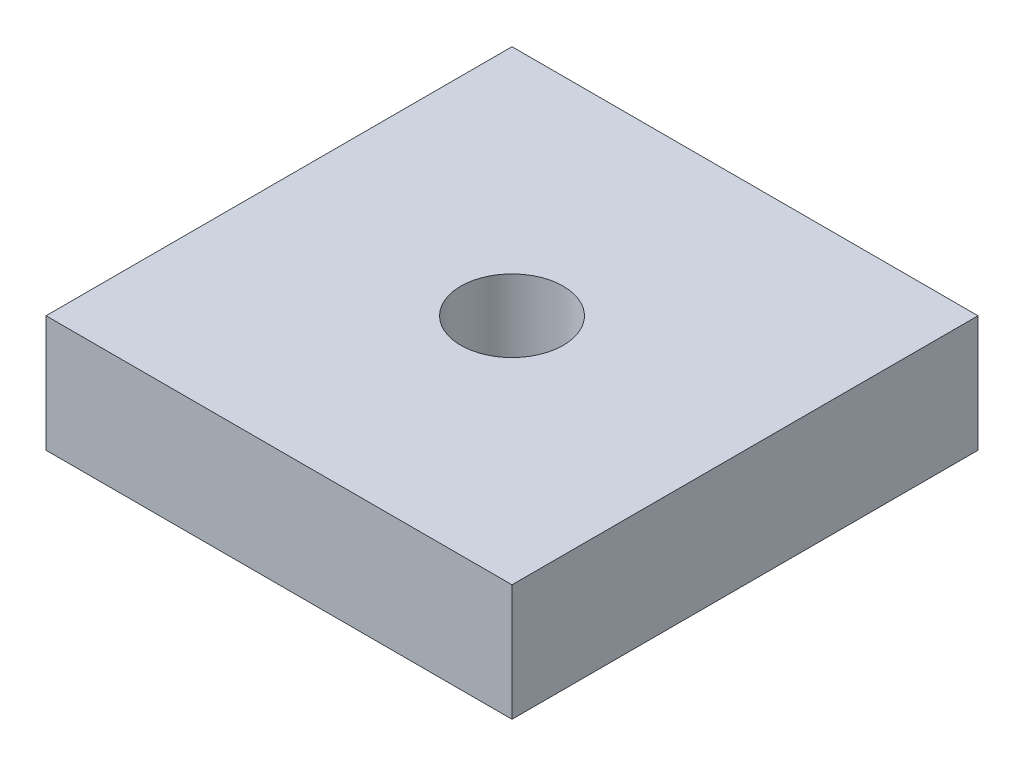
ISO-10303-21;
HEADER;
FILE_DESCRIPTION(('STEP AP214'),'2;1');
FILE_NAME('part.step','',(''),(''),'','','');
FILE_SCHEMA(('AUTOMOTIVE_DESIGN { 1 0 10303 214 1 1 1 1 }'));
ENDSEC;
DATA;
#1=APPLICATION_CONTEXT('core data for automotive mechanical design processes');
#2=APPLICATION_PROTOCOL_DEFINITION('international standard','automotive_design',2000,#1);
#3=PRODUCT_CONTEXT('',#1,'mechanical');
#4=PRODUCT('Part','Part','',(#3));
#5=PRODUCT_RELATED_PRODUCT_CATEGORY('part','',(#4));
#6=PRODUCT_DEFINITION_FORMATION('','',#4);
#7=PRODUCT_DEFINITION_CONTEXT('part definition',#1,'design');
#8=PRODUCT_DEFINITION('design','',#6,#7);
#9=PRODUCT_DEFINITION_SHAPE('','',#8);
#10=(LENGTH_UNIT() NAMED_UNIT(*) SI_UNIT(.MILLI.,.METRE.));
#11=(NAMED_UNIT(*) PLANE_ANGLE_UNIT() SI_UNIT($,.RADIAN.));
#12=(NAMED_UNIT(*) SI_UNIT($,.STERADIAN.) SOLID_ANGLE_UNIT());
#13=UNCERTAINTY_MEASURE_WITH_UNIT(LENGTH_MEASURE(1.E-05),#10,'distance_accuracy_value','');
#14=(GEOMETRIC_REPRESENTATION_CONTEXT(3) GLOBAL_UNCERTAINTY_ASSIGNED_CONTEXT((#13)) GLOBAL_UNIT_ASSIGNED_CONTEXT((#10,
#11,#12)) REPRESENTATION_CONTEXT('',''));
#15=CARTESIAN_POINT('',(0.,0.,0.));
#16=DIRECTION('',(0.,0.,1.));
#17=DIRECTION('',(1.,0.,0.));
#18=AXIS2_PLACEMENT_3D('',#15,#16,#17);
#19=CARTESIAN_POINT('',(0.,-25.,0.));
#20=DIRECTION('',(0.,-1.,0.));
#21=DIRECTION('',(0.,0.,-1.));
#22=AXIS2_PLACEMENT_3D('',#19,#20,#21);
#23=PLANE('',#22);
#24=CARTESIAN_POINT('',(-408.3,-25.,-875.));
#25=DIRECTION('',(0.,-1.,0.));
#26=DIRECTION('',(0.,0.,-1.));
#27=AXIS2_PLACEMENT_3D('',#24,#25,#26);
#28=CIRCLE('',#27,11.);
#29=CARTESIAN_POINT('',(-408.3,-25.,-886.));
#30=VERTEX_POINT('',#29);
#31=EDGE_CURVE('E54',#30,#30,#28,.F.);
#32=ORIENTED_EDGE('',*,*,#31,.T.);
#33=EDGE_LOOP('',(#32));
#34=FACE_BOUND('',#33,.T.);
#35=DIRECTION('',(1.,0.,0.));
#36=VECTOR('',#35,1.);
#37=CARTESIAN_POINT('',(-358.3,-25.,-825.));
#38=LINE('',#37,#36);
#39=CARTESIAN_POINT('',(-458.3,-25.,-825.));
#40=VERTEX_POINT('',#39);
#41=CARTESIAN_POINT('',(-358.3,-25.,-825.));
#42=VERTEX_POINT('',#41);
#43=EDGE_CURVE('E110',#40,#42,#38,.T.);
#44=ORIENTED_EDGE('',*,*,#43,.F.);
#45=DIRECTION('',(0.,0.,1.));
#46=VECTOR('',#45,1.);
#47=CARTESIAN_POINT('',(-458.3,-25.,-825.));
#48=LINE('',#47,#46);
#49=CARTESIAN_POINT('',(-458.3,-25.,-925.));
#50=VERTEX_POINT('',#49);
#51=EDGE_CURVE('E100',#50,#40,#48,.T.);
#52=ORIENTED_EDGE('',*,*,#51,.F.);
#53=DIRECTION('',(-1.,0.,0.));
#54=VECTOR('',#53,1.);
#55=CARTESIAN_POINT('',(-458.3,-25.,-925.));
#56=LINE('',#55,#54);
#57=CARTESIAN_POINT('',(-358.3,-25.,-925.));
#58=VERTEX_POINT('',#57);
#59=EDGE_CURVE('E95',#58,#50,#56,.T.);
#60=ORIENTED_EDGE('',*,*,#59,.F.);
#61=DIRECTION('',(0.,0.,-1.));
#62=VECTOR('',#61,1.);
#63=CARTESIAN_POINT('',(-358.3,-25.,-925.));
#64=LINE('',#63,#62);
#65=EDGE_CURVE('E113',#42,#58,#64,.T.);
#66=ORIENTED_EDGE('',*,*,#65,.F.);
#67=EDGE_LOOP('',(#44,#52,#60,#66));
#68=FACE_BOUND('',#67,.T.);
#69=ADVANCED_FACE('F51',(#34,#68),#23,.T.);
#70=CARTESIAN_POINT('',(-358.3,0.,-825.));
#71=DIRECTION('',(0.,0.,1.));
#72=DIRECTION('',(1.,0.,0.));
#73=AXIS2_PLACEMENT_3D('',#70,#71,#72);
#74=PLANE('',#73);
#75=ORIENTED_EDGE('',*,*,#43,.T.);
#76=DIRECTION('',(0.,1.,0.));
#77=VECTOR('',#76,1.);
#78=CARTESIAN_POINT('',(-358.3,0.,-825.));
#79=LINE('',#78,#77);
#80=CARTESIAN_POINT('',(-358.3,0.,-825.));
#81=VERTEX_POINT('',#80);
#82=EDGE_CURVE('E136',#81,#42,#79,.F.);
#83=ORIENTED_EDGE('',*,*,#82,.F.);
#84=DIRECTION('',(1.,0.,0.));
#85=VECTOR('',#84,1.);
#86=CARTESIAN_POINT('',(0.,0.,-825.));
#87=LINE('',#86,#85);
#88=CARTESIAN_POINT('',(-458.3,0.,-825.));
#89=VERTEX_POINT('',#88);
#90=EDGE_CURVE('E121',#81,#89,#87,.F.);
#91=ORIENTED_EDGE('',*,*,#90,.T.);
#92=DIRECTION('',(0.,1.,0.));
#93=VECTOR('',#92,1.);
#94=CARTESIAN_POINT('',(-458.3,0.,-825.));
#95=LINE('',#94,#93);
#96=EDGE_CURVE('E105',#40,#89,#95,.T.);
#97=ORIENTED_EDGE('',*,*,#96,.F.);
#98=EDGE_LOOP('',(#75,#83,#91,#97));
#99=FACE_BOUND('',#98,.T.);
#100=ADVANCED_FACE('F120',(#99),#74,.T.);
#101=CARTESIAN_POINT('',(-458.3,0.,-825.));
#102=DIRECTION('',(-1.,0.,0.));
#103=DIRECTION('',(0.,0.,1.));
#104=AXIS2_PLACEMENT_3D('',#101,#102,#103);
#105=PLANE('',#104);
#106=ORIENTED_EDGE('',*,*,#51,.T.);
#107=ORIENTED_EDGE('',*,*,#96,.T.);
#108=DIRECTION('',(0.,0.,-1.));
#109=VECTOR('',#108,1.);
#110=CARTESIAN_POINT('',(-458.3,0.,0.));
#111=LINE('',#110,#109);
#112=CARTESIAN_POINT('',(-458.3,0.,-925.));
#113=VERTEX_POINT('',#112);
#114=EDGE_CURVE('E144',#89,#113,#111,.T.);
#115=ORIENTED_EDGE('',*,*,#114,.T.);
#116=DIRECTION('',(0.,1.,0.));
#117=VECTOR('',#116,1.);
#118=CARTESIAN_POINT('',(-458.3,0.,-925.));
#119=LINE('',#118,#117);
#120=EDGE_CURVE('E107',#50,#113,#119,.T.);
#121=ORIENTED_EDGE('',*,*,#120,.F.);
#122=EDGE_LOOP('',(#106,#107,#115,#121));
#123=FACE_BOUND('',#122,.T.);
#124=ADVANCED_FACE('F102',(#123),#105,.T.);
#125=CARTESIAN_POINT('',(-458.3,0.,-925.));
#126=DIRECTION('',(0.,0.,-1.));
#127=DIRECTION('',(-1.,0.,0.));
#128=AXIS2_PLACEMENT_3D('',#125,#126,#127);
#129=PLANE('',#128);
#130=ORIENTED_EDGE('',*,*,#59,.T.);
#131=ORIENTED_EDGE('',*,*,#120,.T.);
#132=DIRECTION('',(1.,0.,0.));
#133=VECTOR('',#132,1.);
#134=CARTESIAN_POINT('',(0.,0.,-925.));
#135=LINE('',#134,#133);
#136=CARTESIAN_POINT('',(-358.3,0.,-925.));
#137=VERTEX_POINT('',#136);
#138=EDGE_CURVE('E147',#113,#137,#135,.T.);
#139=ORIENTED_EDGE('',*,*,#138,.T.);
#140=DIRECTION('',(0.,1.,0.));
#141=VECTOR('',#140,1.);
#142=CARTESIAN_POINT('',(-358.3,0.,-925.));
#143=LINE('',#142,#141);
#144=EDGE_CURVE('E73',#58,#137,#143,.T.);
#145=ORIENTED_EDGE('',*,*,#144,.F.);
#146=EDGE_LOOP('',(#130,#131,#139,#145));
#147=FACE_BOUND('',#146,.T.);
#148=ADVANCED_FACE('F156',(#147),#129,.T.);
#149=CARTESIAN_POINT('',(-358.3,0.,-925.));
#150=DIRECTION('',(1.,0.,0.));
#151=DIRECTION('',(0.,0.,-1.));
#152=AXIS2_PLACEMENT_3D('',#149,#150,#151);
#153=PLANE('',#152);
#154=ORIENTED_EDGE('',*,*,#65,.T.);
#155=ORIENTED_EDGE('',*,*,#144,.T.);
#156=DIRECTION('',(0.,0.,-1.));
#157=VECTOR('',#156,1.);
#158=CARTESIAN_POINT('',(-358.3,0.,0.));
#159=LINE('',#158,#157);
#160=EDGE_CURVE('E61',#137,#81,#159,.F.);
#161=ORIENTED_EDGE('',*,*,#160,.T.);
#162=ORIENTED_EDGE('',*,*,#82,.T.);
#163=EDGE_LOOP('',(#154,#155,#161,#162));
#164=FACE_BOUND('',#163,.T.);
#165=ADVANCED_FACE('F152',(#164),#153,.T.);
#166=CARTESIAN_POINT('',(-408.3,0.,-875.));
#167=DIRECTION('',(0.,-1.,0.));
#168=DIRECTION('',(0.,0.,-1.));
#169=AXIS2_PLACEMENT_3D('',#166,#167,#168);
#170=CYLINDRICAL_SURFACE('',#169,11.);
#171=ORIENTED_EDGE('',*,*,#31,.F.);
#172=EDGE_LOOP('',(#171));
#173=FACE_BOUND('',#172,.T.);
#174=CARTESIAN_POINT('',(-408.3,0.,-875.));
#175=DIRECTION('',(0.,-1.,0.));
#176=DIRECTION('',(0.,0.,-1.));
#177=AXIS2_PLACEMENT_3D('',#174,#175,#176);
#178=CIRCLE('',#177,11.);
#179=CARTESIAN_POINT('',(-408.3,0.,-886.));
#180=VERTEX_POINT('',#179);
#181=EDGE_CURVE('E12',#180,#180,#178,.F.);
#182=ORIENTED_EDGE('',*,*,#181,.T.);
#183=EDGE_LOOP('',(#182));
#184=FACE_BOUND('',#183,.T.);
#185=ADVANCED_FACE('F163',(#173,#184),#170,.F.);
#186=CARTESIAN_POINT('',(0.,0.,0.));
#187=DIRECTION('',(0.,-1.,0.));
#188=DIRECTION('',(0.,0.,-1.));
#189=AXIS2_PLACEMENT_3D('',#186,#187,#188);
#190=PLANE('',#189);
#191=ORIENTED_EDGE('',*,*,#181,.F.);
#192=EDGE_LOOP('',(#191));
#193=FACE_BOUND('',#192,.T.);
#194=ORIENTED_EDGE('',*,*,#138,.F.);
#195=ORIENTED_EDGE('',*,*,#114,.F.);
#196=ORIENTED_EDGE('',*,*,#90,.F.);
#197=ORIENTED_EDGE('',*,*,#160,.F.);
#198=EDGE_LOOP('',(#194,#195,#196,#197));
#199=FACE_BOUND('',#198,.T.);
#200=ADVANCED_FACE('F155',(#193,#199),#190,.F.);
#201=CLOSED_SHELL('',(#69,#100,#124,#148,#165,#185,#200));
#202=MANIFOLD_SOLID_BREP('B2',#201);
#203=ADVANCED_BREP_SHAPE_REPRESENTATION('',(#18,#202),#14);
#204=SHAPE_DEFINITION_REPRESENTATION(#9,#203);
ENDSEC;
END-ISO-10303-21;
